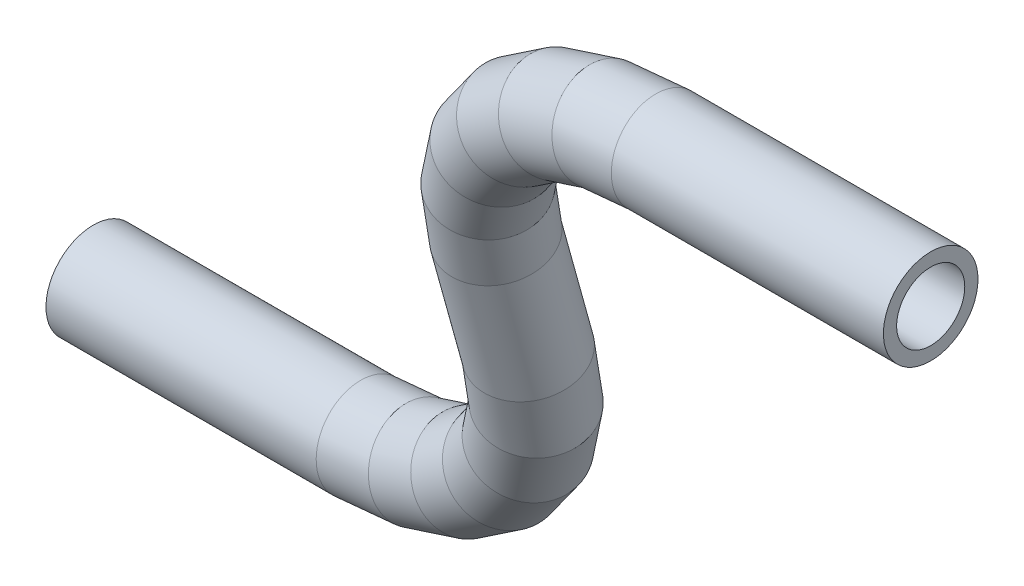
ISO-10303-21;
HEADER;
FILE_DESCRIPTION(('STEP AP214'),'2;1');
FILE_NAME('part.step','',(''),(''),'','','');
FILE_SCHEMA(('AUTOMOTIVE_DESIGN { 1 0 10303 214 1 1 1 1 }'));
ENDSEC;
DATA;
#1=APPLICATION_CONTEXT('core data for automotive mechanical design processes');
#2=APPLICATION_PROTOCOL_DEFINITION('international standard','automotive_design',2000,#1);
#3=PRODUCT_CONTEXT('',#1,'mechanical');
#4=PRODUCT('Part','Part','',(#3));
#5=PRODUCT_RELATED_PRODUCT_CATEGORY('part','',(#4));
#6=PRODUCT_DEFINITION_FORMATION('','',#4);
#7=PRODUCT_DEFINITION_CONTEXT('part definition',#1,'design');
#8=PRODUCT_DEFINITION('design','',#6,#7);
#9=PRODUCT_DEFINITION_SHAPE('','',#8);
#10=(LENGTH_UNIT() NAMED_UNIT(*) SI_UNIT(.MILLI.,.METRE.));
#11=(NAMED_UNIT(*) PLANE_ANGLE_UNIT() SI_UNIT($,.RADIAN.));
#12=(NAMED_UNIT(*) SI_UNIT($,.STERADIAN.) SOLID_ANGLE_UNIT());
#13=UNCERTAINTY_MEASURE_WITH_UNIT(LENGTH_MEASURE(1.E-05),#10,'distance_accuracy_value','');
#14=(GEOMETRIC_REPRESENTATION_CONTEXT(3) GLOBAL_UNCERTAINTY_ASSIGNED_CONTEXT((#13)) GLOBAL_UNIT_ASSIGNED_CONTEXT((#10,
#11,#12)) REPRESENTATION_CONTEXT('',''));
#15=CARTESIAN_POINT('',(0.,0.,0.));
#16=DIRECTION('',(0.,0.,1.));
#17=DIRECTION('',(1.,0.,0.));
#18=AXIS2_PLACEMENT_3D('',#15,#16,#17);
#19=CARTESIAN_POINT('',(-2128.58562550298,-63.4415450925657,-29.5832783218494));
#20=DIRECTION('',(-1.,0.,0.));
#21=DIRECTION('',(0.,0.,1.));
#22=AXIS2_PLACEMENT_3D('',#19,#20,#21);
#23=CYLINDRICAL_SURFACE('',#22,3.175);
#24=CARTESIAN_POINT('',(-2129.18796047896,-63.4415450925662,-29.5832783218491));
#25=DIRECTION('',(-0.997858923238603,-0.0630260562709326,-0.0174724223858227));
#26=DIRECTION('',(0.0654031292301474,-0.961591798233087,-0.266577651459687));
#27=AXIS2_PLACEMENT_3D('',#24,#25,#26);
#28=ELLIPSE('',#27,3.18181250481318,3.175);
#29=CARTESIAN_POINT('',(-2128.97985998452,-66.50114990071,-30.4314784267672));
#30=VERTEX_POINT('',#29);
#31=EDGE_CURVE('E45',#30,#30,#28,.T.);
#32=ORIENTED_EDGE('',*,*,#31,.T.);
#33=EDGE_LOOP('',(#32));
#34=FACE_BOUND('',#33,.T.);
#35=CARTESIAN_POINT('',(-2147.38796047896,-63.4415450925657,-29.5832783218494));
#36=DIRECTION('',(1.,0.,0.));
#37=DIRECTION('',(0.,0.,-1.));
#38=AXIS2_PLACEMENT_3D('',#35,#36,#37);
#39=CIRCLE('',#38,3.175);
#40=CARTESIAN_POINT('',(-2147.38796047896,-63.4415450925657,-32.7582783218494));
#41=VERTEX_POINT('',#40);
#42=EDGE_CURVE('E98',#41,#41,#39,.T.);
#43=ORIENTED_EDGE('',*,*,#42,.T.);
#44=EDGE_LOOP('',(#43));
#45=FACE_BOUND('',#44,.T.);
#46=ADVANCED_FACE('F39',(#34,#45),#23,.T.);
#47=CARTESIAN_POINT('',(-2124.20615790968,-62.8095157810567,-29.408063755933));
#48=DIRECTION('',(-0.991444861373809,-0.125782225292977,-0.0348700251765742));
#49=DIRECTION('',(0.125858765577275,-0.992048169761612,0.));
#50=AXIS2_PLACEMENT_3D('',#47,#48,#49);
#51=CYLINDRICAL_SURFACE('',#50,3.175);
#52=CARTESIAN_POINT('',(-2125.30567480242,-62.9490088450726,-29.4467347735818));
#53=DIRECTION('',(-0.965925826289069,-0.249412281837751,-0.0691434145545732));
#54=DIRECTION('',(0.258819045102518,-0.930819307850187,-0.258046736126463));
#55=AXIS2_PLACEMENT_3D('',#52,#53,#54);
#56=ELLIPSE('',#55,3.20239694984198,3.175);
#57=CARTESIAN_POINT('',(-2124.47683348182,-65.9298617573861,-30.2731028542698));
#58=VERTEX_POINT('',#57);
#59=EDGE_CURVE('E137',#58,#58,#56,.T.);
#60=ORIENTED_EDGE('',*,*,#59,.T.);
#61=EDGE_LOOP('',(#60));
#62=FACE_BOUND('',#61,.T.);
#63=ORIENTED_EDGE('',*,*,#31,.F.);
#64=EDGE_LOOP('',(#63));
#65=FACE_BOUND('',#64,.T.);
#66=ADVANCED_FACE('F144',(#62,#65),#51,.T.);
#67=CARTESIAN_POINT('',(-2120.66337384542,-61.0959926636453,-28.9330316589448));
#68=DIRECTION('',(-0.923879532511293,-0.368774825090133,-0.102233740939367));
#69=DIRECTION('',(0.37071723346585,-0.92874578481489,0.));
#70=AXIS2_PLACEMENT_3D('',#67,#68,#69);
#71=CYLINDRICAL_SURFACE('',#70,3.175);
#72=CARTESIAN_POINT('',(-2121.68796047896,-61.5049656339033,-29.0464093459449));
#73=DIRECTION('',(-0.866025403784438,-0.481827528841549,-0.13357481967215));
#74=DIRECTION('',(0.500000000000001,-0.834549760438917,-0.23135837428402));
#75=AXIS2_PLACEMENT_3D('',#72,#73,#74);
#76=ELLIPSE('',#75,3.20239694984199,3.175);
#77=CARTESIAN_POINT('',(-2120.08676200404,-64.1775252412242,-29.7873106980724));
#78=VERTEX_POINT('',#77);
#79=EDGE_CURVE('E131',#78,#78,#76,.T.);
#80=ORIENTED_EDGE('',*,*,#79,.T.);
#81=EDGE_LOOP('',(#80));
#82=FACE_BOUND('',#81,.T.);
#83=ORIENTED_EDGE('',*,*,#59,.F.);
#84=EDGE_LOOP('',(#83));
#85=FACE_BOUND('',#84,.T.);
#86=ADVANCED_FACE('F150',(#82,#85),#71,.T.);
#87=CARTESIAN_POINT('',(-2117.70152627269,-58.5572425730689,-28.2292257009152));
#88=DIRECTION('',(-0.793353340291224,-0.586636029986656,-0.162630396206404));
#89=DIRECTION('',(0.594551255216975,-0.804057712431091,0.));
#90=AXIS2_PLACEMENT_3D('',#87,#88,#89);
#91=CYLINDRICAL_SURFACE('',#90,3.175);
#92=CARTESIAN_POINT('',(-2118.58135876116,-59.2078246175059,-28.4095835552631));
#93=DIRECTION('',(-0.70710678118655,-0.681407026012429,-0.188903321571893));
#94=DIRECTION('',(0.707106781186545,-0.681407026012436,-0.188903321571886));
#95=AXIS2_PLACEMENT_3D('',#92,#93,#94);
#96=ELLIPSE('',#95,3.20239694984198,3.175);
#97=CARTESIAN_POINT('',(-2116.31692216188,-61.389960399209,-29.0145269760799));
#98=VERTEX_POINT('',#97);
#99=EDGE_CURVE('E132',#98,#98,#96,.T.);
#100=ORIENTED_EDGE('',*,*,#99,.T.);
#101=EDGE_LOOP('',(#100));
#102=FACE_BOUND('',#101,.T.);
#103=ORIENTED_EDGE('',*,*,#79,.F.);
#104=EDGE_LOOP('',(#103));
#105=FACE_BOUND('',#104,.T.);
#106=ADVANCED_FACE('F155',(#102,#105),#91,.T.);
#107=CARTESIAN_POINT('',(-2115.52246020889,-55.3662771325172,-27.3446090947895));
#108=DIRECTION('',(-0.60876142900874,-0.764518958901413,-0.211944058731393));
#109=DIRECTION('',(0.782291207263531,-0.622912888804018,0.));
#110=AXIS2_PLACEMENT_3D('',#107,#108,#109);
#111=CYLINDRICAL_SURFACE('',#110,3.175);
#112=CARTESIAN_POINT('',(-2116.19757942219,-56.2141321599425,-27.5796560267668));
#113=DIRECTION('',(-0.500000000000009,-0.834549760438915,-0.231358374284011));
#114=DIRECTION('',(0.866025403784433,-0.481827528841555,-0.133574819672157));
#115=AXIS2_PLACEMENT_3D('',#112,#113,#114);
#116=ELLIPSE('',#115,3.20239694984199,3.175);
#117=CARTESIAN_POINT('',(-2113.42422231063,-57.7571351686546,-28.0074156218606));
#118=VERTEX_POINT('',#117);
#119=EDGE_CURVE('E126',#118,#118,#116,.T.);
#120=ORIENTED_EDGE('',*,*,#119,.T.);
#121=EDGE_LOOP('',(#120));
#122=FACE_BOUND('',#121,.T.);
#123=ORIENTED_EDGE('',*,*,#99,.F.);
#124=EDGE_LOOP('',(#123));
#125=FACE_BOUND('',#124,.T.);
#126=ADVANCED_FACE('F266',(#122,#125),#111,.T.);
#127=CARTESIAN_POINT('',(-2114.27467540519,-51.7405553634442,-26.339467000377));
#128=DIRECTION('',(-0.382683432365086,-0.890301184194397,-0.24681408390797));
#129=DIRECTION('',(0.91872388240474,-0.394900529119881,0.));
#130=AXIS2_PLACEMENT_3D('',#127,#128,#129);
#131=CYLINDRICAL_SURFACE('',#130,3.175);
#132=CARTESIAN_POINT('',(-2114.69907308462,-52.7279034548856,-26.6131849500028));
#133=DIRECTION('',(-0.258819045102501,-0.930819307850189,-0.258046736126469));
#134=DIRECTION('',(0.965925826289074,-0.249412281837735,-0.069143414554567));
#135=AXIS2_PLACEMENT_3D('',#132,#133,#134);
#136=ELLIPSE('',#135,3.20239694984199,3.175);
#137=CARTESIAN_POINT('',(-2111.60579516474,-53.5266205854959,-26.834609609874));
#138=VERTEX_POINT('',#137);
#139=EDGE_CURVE('E123',#138,#138,#136,.T.);
#140=ORIENTED_EDGE('',*,*,#139,.T.);
#141=EDGE_LOOP('',(#140));
#142=FACE_BOUND('',#141,.T.);
#143=ORIENTED_EDGE('',*,*,#119,.F.);
#144=EDGE_LOOP('',(#143));
#145=FACE_BOUND('',#144,.T.);
#146=ADVANCED_FACE('F265',(#142,#145),#131,.T.);
#147=CARTESIAN_POINT('',(-2114.1093399881,-48.411241852877,-25.416496797999));
#148=DIRECTION('',(-0.130526192220016,-0.955410855076793,-0.264864137145772));
#149=DIRECTION('',(0.,0.267149639344298,-0.963655057683096));
#150=AXIS2_PLACEMENT_3D('',#147,#148,#149);
#151=CYLINDRICAL_SURFACE('',#150,3.175);
#152=CARTESIAN_POINT('',(-2114.18796047896,-48.9867192273191,-25.5760337316843));
#153=DIRECTION('',(-0.065403129230125,-0.96159179823309,-0.266577651459683));
#154=DIRECTION('',(0.997858923238605,-0.0630260562709107,-0.0174724223858181));
#155=AXIS2_PLACEMENT_3D('',#152,#153,#154);
#156=ELLIPSE('',#155,3.18181250481317,3.175);
#157=CARTESIAN_POINT('',(-2111.01296047896,-49.187256321291,-25.6316277037209));
#158=VERTEX_POINT('',#157);
#159=EDGE_CURVE('E124',#158,#158,#156,.T.);
#160=ORIENTED_EDGE('',*,*,#159,.T.);
#161=EDGE_LOOP('',(#160));
#162=FACE_BOUND('',#161,.T.);
#163=ORIENTED_EDGE('',*,*,#139,.F.);
#164=EDGE_LOOP('',(#163));
#165=FACE_BOUND('',#164,.T.);
#166=ADVANCED_FACE('F256',(#162,#165),#151,.T.);
#167=CARTESIAN_POINT('',(-2114.18796047896,-40.5719435335981,-23.2432443442186));
#168=DIRECTION('',(0.,-0.963655057683096,-0.267149639344298));
#169=DIRECTION('',(0.,0.267149639344298,-0.963655057683096));
#170=AXIS2_PLACEMENT_3D('',#167,#168,#169);
#171=CYLINDRICAL_SURFACE('',#170,3.175);
#172=CARTESIAN_POINT('',(-2114.18796047896,-41.1523866796198,-23.404157915816));
#173=DIRECTION('',(-0.0654031292301811,-0.961591798233086,-0.266577651459682));
#174=DIRECTION('',(-0.997858923238601,0.0630260562709627,0.0174724223858404));
#175=AXIS2_PLACEMENT_3D('',#172,#173,#174);
#176=ELLIPSE('',#175,3.18181250481319,3.175);
#177=CARTESIAN_POINT('',(-2117.36296047896,-40.9518495856478,-23.3485639437793));
#178=VERTEX_POINT('',#177);
#179=EDGE_CURVE('E116',#178,#178,#176,.T.);
#180=ORIENTED_EDGE('',*,*,#179,.T.);
#181=EDGE_LOOP('',(#180));
#182=FACE_BOUND('',#181,.T.);
#183=ORIENTED_EDGE('',*,*,#159,.F.);
#184=EDGE_LOOP('',(#183));
#185=FACE_BOUND('',#184,.T.);
#186=ADVANCED_FACE('F255',(#182,#185),#171,.T.);
#187=CARTESIAN_POINT('',(-2113.53209372822,-36.3516474373593,-22.0732711561497));
#188=DIRECTION('',(-0.130526192220127,-0.955410855076779,-0.264864137145768));
#189=DIRECTION('',(0.,0.267149639344297,-0.963655057683096));
#190=AXIS2_PLACEMENT_3D('',#187,#188,#189);
#191=CYLINDRICAL_SURFACE('',#190,3.175);
#192=CARTESIAN_POINT('',(-2113.67684787329,-37.4112024520535,-22.3670066974976));
#193=DIRECTION('',(-0.258819045102505,-0.930819307850189,-0.258046736126469));
#194=DIRECTION('',(-0.965925826289073,0.24941228183774,0.0691434145545635));
#195=AXIS2_PLACEMENT_3D('',#192,#193,#194);
#196=ELLIPSE('',#195,3.20239694984195,3.175);
#197=CARTESIAN_POINT('',(-2116.77012579318,-36.6124853214432,-22.1455820376264));
#198=VERTEX_POINT('',#197);
#199=EDGE_CURVE('E117',#198,#198,#196,.T.);
#200=ORIENTED_EDGE('',*,*,#199,.T.);
#201=EDGE_LOOP('',(#200));
#202=FACE_BOUND('',#201,.T.);
#203=ORIENTED_EDGE('',*,*,#179,.F.);
#204=EDGE_LOOP('',(#203));
#205=FACE_BOUND('',#204,.T.);
#206=ADVANCED_FACE('F248',(#202,#205),#191,.T.);
#207=CARTESIAN_POINT('',(-2111.75394385629,-32.9376256555554,-21.1268176711079));
#208=DIRECTION('',(-0.382683432364989,-0.890301184194436,-0.246814083907981));
#209=DIRECTION('',(0.918723882404783,-0.394900529119781,0.));
#210=AXIS2_PLACEMENT_3D('',#207,#208,#209);
#211=CYLINDRICAL_SURFACE('',#210,3.175);
#212=CARTESIAN_POINT('',(-2112.17834153572,-33.9249737469965,-21.4005356207339));
#213=DIRECTION('',(-0.499999999999964,-0.83454976043894,-0.231358374284019));
#214=DIRECTION('',(-0.866025403784459,0.481827528841512,0.133574819672144));
#215=AXIS2_PLACEMENT_3D('',#212,#213,#214);
#216=ELLIPSE('',#215,3.20239694984201,3.175);
#217=CARTESIAN_POINT('',(-2114.95169864729,-32.3819707382845,-20.9727760256402));
#218=VERTEX_POINT('',#217);
#219=EDGE_CURVE('E114',#218,#218,#216,.T.);
#220=ORIENTED_EDGE('',*,*,#219,.T.);
#221=EDGE_LOOP('',(#220));
#222=FACE_BOUND('',#221,.T.);
#223=ORIENTED_EDGE('',*,*,#199,.F.);
#224=EDGE_LOOP('',(#223));
#225=FACE_BOUND('',#224,.T.);
#226=ADVANCED_FACE('F247',(#222,#225),#211,.T.);
#227=CARTESIAN_POINT('',(-2109.11944298345,-30.083426262008,-20.3355611602604));
#228=DIRECTION('',(-0.608761429008742,-0.764518958901412,-0.211944058731393));
#229=DIRECTION('',(0.78229120726353,-0.62291288880402,0.));
#230=AXIS2_PLACEMENT_3D('',#227,#228,#229);
#231=CYLINDRICAL_SURFACE('',#230,3.175);
#232=CARTESIAN_POINT('',(-2109.79456219676,-30.9312812894331,-20.5706080922377));
#233=DIRECTION('',(-0.707106781186574,-0.681407026012405,-0.188903321571886));
#234=DIRECTION('',(-0.707106781186521,0.681407026012457,0.1889033215719));
#235=AXIS2_PLACEMENT_3D('',#232,#233,#234);
#236=ELLIPSE('',#235,3.20239694984199,3.175);
#237=CARTESIAN_POINT('',(-2112.05899879604,-28.7491455077299,-19.9656646714209));
#238=VERTEX_POINT('',#237);
#239=EDGE_CURVE('E109',#238,#238,#236,.T.);
#240=ORIENTED_EDGE('',*,*,#239,.T.);
#241=EDGE_LOOP('',(#240));
#242=FACE_BOUND('',#241,.T.);
#243=ORIENTED_EDGE('',*,*,#219,.F.);
#244=EDGE_LOOP('',(#243));
#245=FACE_BOUND('',#244,.T.);
#246=ADVANCED_FACE('F245',(#242,#245),#231,.T.);
#247=CARTESIAN_POINT('',(-2105.80812799049,-27.9835582285992,-19.7534244472082));
#248=DIRECTION('',(-0.793353340291266,-0.586636029986604,-0.162630396206389));
#249=DIRECTION('',(0.594551255216922,-0.804057712431131,0.));
#250=AXIS2_PLACEMENT_3D('',#247,#248,#249);
#251=CYLINDRICAL_SURFACE('',#250,3.175);
#252=CARTESIAN_POINT('',(-2106.68796047896,-28.6341402730357,-19.9337823015559));
#253=DIRECTION('',(-0.866025403784444,-0.481827528841538,-0.133574819672147));
#254=DIRECTION('',(-0.49999999999999,0.834549760438926,0.231358374284013));
#255=AXIS2_PLACEMENT_3D('',#252,#253,#254);
#256=ELLIPSE('',#255,3.20239694984197,3.175);
#257=CARTESIAN_POINT('',(-2108.28915895388,-25.9615806657148,-19.1928809494284));
#258=VERTEX_POINT('',#257);
#259=EDGE_CURVE('E110',#258,#258,#256,.T.);
#260=ORIENTED_EDGE('',*,*,#259,.T.);
#261=EDGE_LOOP('',(#260));
#262=FACE_BOUND('',#261,.T.);
#263=ORIENTED_EDGE('',*,*,#239,.F.);
#264=EDGE_LOOP('',(#263));
#265=FACE_BOUND('',#264,.T.);
#266=ADVANCED_FACE('F236',(#262,#265),#251,.T.);
#267=CARTESIAN_POINT('',(-2102.04565952196,-26.7811240916086,-19.420079186919));
#268=DIRECTION('',(-0.923879532511276,-0.36877482509017,-0.102233740939379));
#269=DIRECTION('',(0.370717233465888,-0.928745784814875,0.));
#270=AXIS2_PLACEMENT_3D('',#267,#268,#269);
#271=CYLINDRICAL_SURFACE('',#270,3.175);
#272=CARTESIAN_POINT('',(-2103.0702461555,-27.1900970618669,-19.5334568739191));
#273=DIRECTION('',(-0.965925826289065,-0.249412281837765,-0.0691434145545769));
#274=DIRECTION('',(-0.258819045102532,0.93081930785018,0.258046736126473));
#275=AXIS2_PLACEMENT_3D('',#272,#273,#274);
#276=ELLIPSE('',#275,3.20239694984199,3.175);
#277=CARTESIAN_POINT('',(-2103.89908747609,-24.2092441495535,-18.707088793231));
#278=VERTEX_POINT('',#277);
#279=EDGE_CURVE('E102',#278,#278,#276,.T.);
#280=ORIENTED_EDGE('',*,*,#279,.T.);
#281=EDGE_LOOP('',(#280));
#282=FACE_BOUND('',#281,.T.);
#283=ORIENTED_EDGE('',*,*,#259,.F.);
#284=EDGE_LOOP('',(#283));
#285=FACE_BOUND('',#284,.T.);
#286=ADVANCED_FACE('F231',(#282,#285),#271,.T.);
#287=CARTESIAN_POINT('',(-2098.5907785622,-26.6217977807229,-19.3759098898745));
#288=DIRECTION('',(-0.991444861373811,-0.125782225292965,-0.0348700251765693));
#289=DIRECTION('',(0.125858765577264,-0.992048169761614,0.));
#290=AXIS2_PLACEMENT_3D('',#287,#288,#289);
#291=CYLINDRICAL_SURFACE('',#290,3.175);
#292=CARTESIAN_POINT('',(-2099.18796047896,-26.6975608143733,-19.3969133256516));
#293=DIRECTION('',(-0.997858923238604,-0.0630260562709268,-0.0174724223858203));
#294=DIRECTION('',(-0.0654031292301412,0.961591798233091,0.266577651459675));
#295=AXIS2_PLACEMENT_3D('',#292,#293,#294);
#296=ELLIPSE('',#295,3.18181250481318,3.175);
#297=CARTESIAN_POINT('',(-2099.3960609734,-23.6379560062294,-18.5487132207335));
#298=VERTEX_POINT('',#297);
#299=EDGE_CURVE('E101',#298,#298,#296,.T.);
#300=ORIENTED_EDGE('',*,*,#299,.T.);
#301=EDGE_LOOP('',(#300));
#302=FACE_BOUND('',#301,.T.);
#303=ORIENTED_EDGE('',*,*,#279,.F.);
#304=EDGE_LOOP('',(#303));
#305=FACE_BOUND('',#304,.T.);
#306=ADVANCED_FACE('F228',(#302,#305),#291,.T.);
#307=CARTESIAN_POINT('',(-2080.98796047896,-26.6975608143733,-19.3969133256516));
#308=DIRECTION('',(-1.,0.,0.));
#309=DIRECTION('',(0.,0.,1.));
#310=AXIS2_PLACEMENT_3D('',#307,#308,#309);
#311=CYLINDRICAL_SURFACE('',#310,3.175);
#312=CARTESIAN_POINT('',(-2080.98796047896,-26.6975608143733,-19.3969133256516));
#313=DIRECTION('',(1.,0.,0.));
#314=DIRECTION('',(0.,0.,-1.));
#315=AXIS2_PLACEMENT_3D('',#312,#313,#314);
#316=CIRCLE('',#315,3.175);
#317=CARTESIAN_POINT('',(-2080.98796047896,-26.6975608143733,-22.5719133256516));
#318=VERTEX_POINT('',#317);
#319=EDGE_CURVE('E92',#318,#318,#316,.T.);
#320=ORIENTED_EDGE('',*,*,#319,.F.);
#321=EDGE_LOOP('',(#320));
#322=FACE_BOUND('',#321,.T.);
#323=ORIENTED_EDGE('',*,*,#299,.F.);
#324=EDGE_LOOP('',(#323));
#325=FACE_BOUND('',#324,.T.);
#326=ADVANCED_FACE('F227',(#322,#325),#311,.T.);
#327=CARTESIAN_POINT('',(-2147.38796047896,-63.4415450925657,-29.5832783218494));
#328=DIRECTION('',(1.,0.,0.));
#329=DIRECTION('',(0.,0.,-1.));
#330=AXIS2_PLACEMENT_3D('',#327,#328,#329);
#331=PLANE('',#330);
#332=CARTESIAN_POINT('',(-2147.38796047896,-63.4415450925657,-29.5832783218494));
#333=DIRECTION('',(1.,0.,0.));
#334=DIRECTION('',(0.,0.,-1.));
#335=AXIS2_PLACEMENT_3D('',#332,#333,#334);
#336=CIRCLE('',#335,2.286);
#337=CARTESIAN_POINT('',(-2147.38796047896,-63.4415450925657,-31.8692783218494));
#338=VERTEX_POINT('',#337);
#339=EDGE_CURVE('E95',#338,#338,#336,.F.);
#340=ORIENTED_EDGE('',*,*,#339,.F.);
#341=EDGE_LOOP('',(#340));
#342=FACE_BOUND('',#341,.T.);
#343=ORIENTED_EDGE('',*,*,#42,.F.);
#344=EDGE_LOOP('',(#343));
#345=FACE_BOUND('',#344,.T.);
#346=ADVANCED_FACE('F225',(#342,#345),#331,.F.);
#347=CARTESIAN_POINT('',(-2080.98796047896,-26.6975608143733,-19.3969133256516));
#348=DIRECTION('',(1.,0.,0.));
#349=DIRECTION('',(0.,0.,-1.));
#350=AXIS2_PLACEMENT_3D('',#347,#348,#349);
#351=PLANE('',#350);
#352=CARTESIAN_POINT('',(-2080.98796047896,-26.6975608143733,-19.3969133256516));
#353=DIRECTION('',(1.,0.,0.));
#354=DIRECTION('',(0.,0.,-1.));
#355=AXIS2_PLACEMENT_3D('',#352,#353,#354);
#356=CIRCLE('',#355,2.286);
#357=CARTESIAN_POINT('',(-2080.98796047896,-26.6975608143733,-21.6829133256516));
#358=VERTEX_POINT('',#357);
#359=EDGE_CURVE('E46',#358,#358,#356,.F.);
#360=ORIENTED_EDGE('',*,*,#359,.T.);
#361=EDGE_LOOP('',(#360));
#362=FACE_BOUND('',#361,.T.);
#363=ORIENTED_EDGE('',*,*,#319,.T.);
#364=EDGE_LOOP('',(#363));
#365=FACE_BOUND('',#364,.T.);
#366=ADVANCED_FACE('F217',(#362,#365),#351,.T.);
#367=CARTESIAN_POINT('',(-2128.72627929625,-63.4415450925657,-29.5832783218494));
#368=DIRECTION('',(-1.,0.,0.));
#369=DIRECTION('',(0.,0.,1.));
#370=AXIS2_PLACEMENT_3D('',#367,#368,#369);
#371=CYLINDRICAL_SURFACE('',#370,2.286);
#372=CARTESIAN_POINT('',(-2129.18796047896,-63.4415450925662,-29.5832783218491));
#373=DIRECTION('',(-0.997858923238603,-0.0630260562709326,-0.0174724223858227));
#374=DIRECTION('',(0.0654031292301474,-0.961591798233087,-0.266577651459687));
#375=AXIS2_PLACEMENT_3D('',#372,#373,#374);
#376=ELLIPSE('',#375,2.29090500346549,2.286);
#377=CARTESIAN_POINT('',(-2129.03812812296,-65.6444605544298,-30.1939823973902));
#378=VERTEX_POINT('',#377);
#379=EDGE_CURVE('E90',#378,#378,#376,.F.);
#380=ORIENTED_EDGE('',*,*,#379,.T.);
#381=EDGE_LOOP('',(#380));
#382=FACE_BOUND('',#381,.T.);
#383=ORIENTED_EDGE('',*,*,#339,.T.);
#384=EDGE_LOOP('',(#383));
#385=FACE_BOUND('',#384,.T.);
#386=ADVANCED_FACE('F212',(#382,#385),#371,.F.);
#387=CARTESIAN_POINT('',(-2124.48626218353,-62.8450519366729,-29.4179152801696));
#388=DIRECTION('',(-0.991444861373809,-0.125782225292977,-0.0348700251765742));
#389=DIRECTION('',(0.125858765577275,-0.992048169761612,0.));
#390=AXIS2_PLACEMENT_3D('',#387,#388,#389);
#391=CYLINDRICAL_SURFACE('',#390,2.286);
#392=CARTESIAN_POINT('',(-2125.30567480242,-62.9490088450726,-29.4467347735817));
#393=DIRECTION('',(-0.965925826289069,-0.249412281837751,-0.0691434145545732));
#394=DIRECTION('',(0.258819045102518,-0.930819307850186,-0.258046736126464));
#395=AXIS2_PLACEMENT_3D('',#392,#393,#394);
#396=ELLIPSE('',#395,2.30572580388623,2.286);
#397=CARTESIAN_POINT('',(-2124.70890905159,-65.0952229419383,-30.0417197916772));
#398=VERTEX_POINT('',#397);
#399=EDGE_CURVE('E88',#398,#398,#396,.F.);
#400=ORIENTED_EDGE('',*,*,#399,.T.);
#401=EDGE_LOOP('',(#400));
#402=FACE_BOUND('',#401,.T.);
#403=ORIENTED_EDGE('',*,*,#379,.F.);
#404=EDGE_LOOP('',(#403));
#405=FACE_BOUND('',#404,.T.);
#406=ADVANCED_FACE('F209',(#402,#405),#391,.F.);
#407=CARTESIAN_POINT('',(-2120.9243894759,-61.2001794002152,-28.9619148665586));
#408=DIRECTION('',(-0.923879532511293,-0.368774825090133,-0.102233740939367));
#409=DIRECTION('',(0.37071723346585,-0.92874578481489,0.));
#410=AXIS2_PLACEMENT_3D('',#407,#408,#409);
#411=CYLINDRICAL_SURFACE('',#410,2.286);
#412=CARTESIAN_POINT('',(-2121.68796047896,-61.5049656339032,-29.0464093459448));
#413=DIRECTION('',(-0.866025403784438,-0.481827528841549,-0.13357481967215));
#414=DIRECTION('',(0.500000000000001,-0.834549760438917,-0.23135837428402));
#415=AXIS2_PLACEMENT_3D('',#412,#413,#414);
#416=ELLIPSE('',#415,2.30572580388623,2.286);
#417=CARTESIAN_POINT('',(-2120.53509757701,-63.4292085511743,-29.5798583194767));
#418=VERTEX_POINT('',#417);
#419=EDGE_CURVE('E85',#418,#418,#416,.F.);
#420=ORIENTED_EDGE('',*,*,#419,.T.);
#421=EDGE_LOOP('',(#420));
#422=FACE_BOUND('',#421,.T.);
#423=ORIENTED_EDGE('',*,*,#399,.F.);
#424=EDGE_LOOP('',(#423));
#425=FACE_BOUND('',#424,.T.);
#426=ADVANCED_FACE('F206',(#422,#425),#411,.F.);
#427=CARTESIAN_POINT('',(-2117.92566547594,-58.7229797366715,-28.2751722490388));
#428=DIRECTION('',(-0.793353340291224,-0.586636029986656,-0.162630396206404));
#429=DIRECTION('',(0.594551255216975,-0.804057712431091,0.));
#430=AXIS2_PLACEMENT_3D('',#427,#428,#429);
#431=CYLINDRICAL_SURFACE('',#430,2.286);
#432=CARTESIAN_POINT('',(-2118.58135876116,-59.2078246175058,-28.4095835552631));
#433=DIRECTION('',(-0.70710678118655,-0.681407026012429,-0.188903321571893));
#434=DIRECTION('',(0.707106781186545,-0.681407026012436,-0.188903321571886));
#435=AXIS2_PLACEMENT_3D('',#432,#433,#434);
#436=ELLIPSE('',#435,2.30572580388622,2.286);
#437=CARTESIAN_POINT('',(-2116.95096440967,-60.7789623803321,-28.8451428182512));
#438=VERTEX_POINT('',#437);
#439=EDGE_CURVE('E78',#438,#438,#436,.F.);
#440=ORIENTED_EDGE('',*,*,#439,.T.);
#441=EDGE_LOOP('',(#440));
#442=FACE_BOUND('',#441,.T.);
#443=ORIENTED_EDGE('',*,*,#419,.F.);
#444=EDGE_LOOP('',(#443));
#445=FACE_BOUND('',#444,.T.);
#446=ADVANCED_FACE('F205',(#442,#445),#431,.F.);
#447=CARTESIAN_POINT('',(-2115.6944482686,-55.5822700093469,-27.4044878020986));
#448=DIRECTION('',(-0.60876142900874,-0.764518958901413,-0.211944058731393));
#449=DIRECTION('',(0.782291207263531,-0.622912888804018,0.));
#450=AXIS2_PLACEMENT_3D('',#447,#448,#449);
#451=CYLINDRICAL_SURFACE('',#450,2.286);
#452=CARTESIAN_POINT('',(-2116.19757942219,-56.2141321599425,-27.5796560267668));
#453=DIRECTION('',(-0.500000000000009,-0.834549760438915,-0.231358374284011));
#454=DIRECTION('',(0.866025403784433,-0.481827528841555,-0.133574819672156));
#455=AXIS2_PLACEMENT_3D('',#452,#453,#454);
#456=ELLIPSE('',#455,2.30572580388623,2.286);
#457=CARTESIAN_POINT('',(-2114.20076230186,-57.3250943262152,-27.8876429352343));
#458=VERTEX_POINT('',#457);
#459=EDGE_CURVE('E80',#458,#458,#456,.F.);
#460=ORIENTED_EDGE('',*,*,#459,.T.);
#461=EDGE_LOOP('',(#460));
#462=FACE_BOUND('',#461,.T.);
#463=ORIENTED_EDGE('',*,*,#439,.F.);
#464=EDGE_LOOP('',(#463));
#465=FACE_BOUND('',#464,.T.);
#466=ADVANCED_FACE('F196',(#462,#465),#451,.F.);
#467=CARTESIAN_POINT('',(-2114.38279161932,-51.9920843958903,-26.4091972319229));
#468=DIRECTION('',(-0.382683432365086,-0.890301184194397,-0.24681408390797));
#469=DIRECTION('',(0.91872388240474,-0.394900529119881,0.));
#470=AXIS2_PLACEMENT_3D('',#467,#468,#469);
#471=CYLINDRICAL_SURFACE('',#470,2.286);
#472=CARTESIAN_POINT('',(-2114.69907308462,-52.7279034548856,-26.6131849500029));
#473=DIRECTION('',(-0.258819045102501,-0.930819307850189,-0.258046736126469));
#474=DIRECTION('',(0.965925826289074,-0.249412281837735,-0.0691434145545673));
#475=AXIS2_PLACEMENT_3D('',#472,#473,#474);
#476=ELLIPSE('',#475,2.30572580388623,2.286);
#477=CARTESIAN_POINT('',(-2112.47191298231,-53.3029797889251,-26.7726107051101));
#478=VERTEX_POINT('',#477);
#479=EDGE_CURVE('E74',#478,#478,#476,.F.);
#480=ORIENTED_EDGE('',*,*,#479,.T.);
#481=EDGE_LOOP('',(#480));
#482=FACE_BOUND('',#481,.T.);
#483=ORIENTED_EDGE('',*,*,#459,.F.);
#484=EDGE_LOOP('',(#483));
#485=FACE_BOUND('',#484,.T.);
#486=ADVANCED_FACE('F191',(#482,#485),#471,.F.);
#487=CARTESIAN_POINT('',(-2114.12769899216,-48.5456240137785,-25.4537509435907));
#488=DIRECTION('',(-0.130526192220016,-0.955410855076793,-0.264864137145772));
#489=DIRECTION('',(0.,0.267149639344298,-0.963655057683096));
#490=AXIS2_PLACEMENT_3D('',#487,#488,#489);
#491=CYLINDRICAL_SURFACE('',#490,2.286);
#492=CARTESIAN_POINT('',(-2114.18796047896,-48.9867192273191,-25.5760337316844));
#493=DIRECTION('',(-0.065403129230125,-0.96159179823309,-0.266577651459683));
#494=DIRECTION('',(0.997858923238605,-0.0630260562709105,-0.0174724223858189));
#495=AXIS2_PLACEMENT_3D('',#492,#493,#494);
#496=ELLIPSE('',#495,2.29090500346548,2.286);
#497=CARTESIAN_POINT('',(-2111.90196047896,-49.1311059349788,-25.6160613915507));
#498=VERTEX_POINT('',#497);
#499=EDGE_CURVE('E72',#498,#498,#496,.F.);
#500=ORIENTED_EDGE('',*,*,#499,.T.);
#501=EDGE_LOOP('',(#500));
#502=FACE_BOUND('',#501,.T.);
#503=ORIENTED_EDGE('',*,*,#479,.F.);
#504=EDGE_LOOP('',(#503));
#505=FACE_BOUND('',#504,.T.);
#506=ADVANCED_FACE('F188',(#502,#505),#491,.F.);
#507=CARTESIAN_POINT('',(-2114.18796047896,-40.7074852728693,-23.2808199543644));
#508=DIRECTION('',(0.,-0.963655057683096,-0.267149639344298));
#509=DIRECTION('',(0.,0.267149639344298,-0.963655057683096));
#510=AXIS2_PLACEMENT_3D('',#507,#508,#509);
#511=CYLINDRICAL_SURFACE('',#510,2.286);
#512=CARTESIAN_POINT('',(-2114.18796047896,-41.1523866796198,-23.404157915816));
#513=DIRECTION('',(-0.0654031292301811,-0.961591798233086,-0.266577651459682));
#514=DIRECTION('',(-0.997858923238601,0.0630260562709627,0.0174724223858404));
#515=AXIS2_PLACEMENT_3D('',#512,#513,#514);
#516=ELLIPSE('',#515,2.29090500346549,2.286);
#517=CARTESIAN_POINT('',(-2116.47396047896,-41.0079999719599,-23.3641302559497));
#518=VERTEX_POINT('',#517);
#519=EDGE_CURVE('E70',#518,#518,#516,.F.);
#520=ORIENTED_EDGE('',*,*,#519,.T.);
#521=EDGE_LOOP('',(#520));
#522=FACE_BOUND('',#521,.T.);
#523=ORIENTED_EDGE('',*,*,#499,.F.);
#524=EDGE_LOOP('',(#523));
#525=FACE_BOUND('',#524,.T.);
#526=ADVANCED_FACE('F187',(#522,#525),#511,.F.);
#527=CARTESIAN_POINT('',(-2113.56897015546,-36.6215713375315,-22.148100911887));
#528=DIRECTION('',(-0.130526192220127,-0.955410855076779,-0.264864137145768));
#529=DIRECTION('',(0.,0.267149639344297,-0.963655057683096));
#530=AXIS2_PLACEMENT_3D('',#527,#528,#529);
#531=CYLINDRICAL_SURFACE('',#530,2.286);
#532=CARTESIAN_POINT('',(-2113.67684787329,-37.4112024520536,-22.3670066974977));
#533=DIRECTION('',(-0.258819045102505,-0.930819307850189,-0.258046736126469));
#534=DIRECTION('',(-0.965925826289073,0.24941228183774,0.069143414554563));
#535=AXIS2_PLACEMENT_3D('',#532,#533,#534);
#536=ELLIPSE('',#535,2.3057258038862,2.286);
#537=CARTESIAN_POINT('',(-2115.90400797561,-36.8361261180141,-22.2075809423904));
#538=VERTEX_POINT('',#537);
#539=EDGE_CURVE('E63',#538,#538,#536,.F.);
#540=ORIENTED_EDGE('',*,*,#539,.T.);
#541=EDGE_LOOP('',(#540));
#542=FACE_BOUND('',#541,.T.);
#543=ORIENTED_EDGE('',*,*,#519,.F.);
#544=EDGE_LOOP('',(#543));
#545=FACE_BOUND('',#544,.T.);
#546=ADVANCED_FACE('F185',(#542,#545),#531,.F.);
#547=CARTESIAN_POINT('',(-2111.86206007042,-33.1891546880012,-21.1965479026538));
#548=DIRECTION('',(-0.382683432364989,-0.890301184194436,-0.246814083907981));
#549=DIRECTION('',(0.918723882404783,-0.394900529119781,0.));
#550=AXIS2_PLACEMENT_3D('',#547,#548,#549);
#551=CYLINDRICAL_SURFACE('',#550,2.286);
#552=CARTESIAN_POINT('',(-2112.17834153572,-33.9249737469967,-21.4005356207339));
#553=DIRECTION('',(-0.499999999999964,-0.83454976043894,-0.231358374284019));
#554=DIRECTION('',(-0.866025403784459,0.481827528841512,0.133574819672144));
#555=AXIS2_PLACEMENT_3D('',#552,#553,#554);
#556=ELLIPSE('',#555,2.30572580388625,2.286);
#557=CARTESIAN_POINT('',(-2114.17515865605,-32.8140115807241,-21.0925487122664));
#558=VERTEX_POINT('',#557);
#559=EDGE_CURVE('E65',#558,#558,#556,.F.);
#560=ORIENTED_EDGE('',*,*,#559,.T.);
#561=EDGE_LOOP('',(#560));
#562=FACE_BOUND('',#561,.T.);
#563=ORIENTED_EDGE('',*,*,#539,.F.);
#564=EDGE_LOOP('',(#563));
#565=FACE_BOUND('',#564,.T.);
#566=ADVANCED_FACE('F180',(#562,#565),#551,.F.);
#567=CARTESIAN_POINT('',(-2109.29143104317,-30.2994191388379,-20.3954398675695));
#568=DIRECTION('',(-0.608761429008742,-0.764518958901412,-0.211944058731393));
#569=DIRECTION('',(0.78229120726353,-0.62291288880402,0.));
#570=AXIS2_PLACEMENT_3D('',#567,#568,#569);
#571=CYLINDRICAL_SURFACE('',#570,2.286);
#572=CARTESIAN_POINT('',(-2109.79456219676,-30.9312812894333,-20.5706080922378));
#573=DIRECTION('',(-0.707106781186574,-0.681407026012405,-0.188903321571886));
#574=DIRECTION('',(-0.707106781186521,0.681407026012457,0.1889033215719));
#575=AXIS2_PLACEMENT_3D('',#572,#573,#574);
#576=ELLIPSE('',#575,2.30572580388623,2.286);
#577=CARTESIAN_POINT('',(-2111.42495654824,-29.360143526607,-20.1350488292497));
#578=VERTEX_POINT('',#577);
#579=EDGE_CURVE('E56',#578,#578,#576,.F.);
#580=ORIENTED_EDGE('',*,*,#579,.T.);
#581=EDGE_LOOP('',(#580));
#582=FACE_BOUND('',#581,.T.);
#583=ORIENTED_EDGE('',*,*,#559,.F.);
#584=EDGE_LOOP('',(#583));
#585=FACE_BOUND('',#584,.T.);
#586=ADVANCED_FACE('F171',(#582,#585),#571,.F.);
#587=CARTESIAN_POINT('',(-2106.03226719373,-28.1492953922018,-19.7993709953318));
#588=DIRECTION('',(-0.793353340291266,-0.586636029986604,-0.162630396206389));
#589=DIRECTION('',(0.594551255216922,-0.804057712431131,0.));
#590=AXIS2_PLACEMENT_3D('',#587,#588,#589);
#591=CYLINDRICAL_SURFACE('',#590,2.286);
#592=CARTESIAN_POINT('',(-2106.68796047896,-28.6341402730358,-19.9337823015559));
#593=DIRECTION('',(-0.866025403784444,-0.481827528841538,-0.133574819672147));
#594=DIRECTION('',(-0.49999999999999,0.834549760438926,0.231358374284013));
#595=AXIS2_PLACEMENT_3D('',#592,#593,#594);
#596=ELLIPSE('',#595,2.30572580388622,2.286);
#597=CARTESIAN_POINT('',(-2107.8408233809,-26.7098973557647,-19.4003333280241));
#598=VERTEX_POINT('',#597);
#599=EDGE_CURVE('E57',#598,#598,#596,.F.);
#600=ORIENTED_EDGE('',*,*,#599,.T.);
#601=EDGE_LOOP('',(#600));
#602=FACE_BOUND('',#601,.T.);
#603=ORIENTED_EDGE('',*,*,#579,.F.);
#604=EDGE_LOOP('',(#603));
#605=FACE_BOUND('',#604,.T.);
#606=ADVANCED_FACE('F168',(#602,#605),#591,.F.);
#607=CARTESIAN_POINT('',(-2102.30667515244,-26.8853108281786,-19.4489623945328));
#608=DIRECTION('',(-0.923879532511277,-0.36877482509017,-0.102233740939379));
#609=DIRECTION('',(0.370717233465888,-0.928745784814875,0.));
#610=AXIS2_PLACEMENT_3D('',#607,#608,#609);
#611=CYLINDRICAL_SURFACE('',#610,2.286);
#612=CARTESIAN_POINT('',(-2103.0702461555,-27.190097061867,-19.5334568739191));
#613=DIRECTION('',(-0.965925826289065,-0.249412281837764,-0.0691434145545769));
#614=DIRECTION('',(-0.258819045102532,0.93081930785018,0.258046736126473));
#615=AXIS2_PLACEMENT_3D('',#612,#613,#614);
#616=ELLIPSE('',#615,2.30572580388623,2.286);
#617=CARTESIAN_POINT('',(-2103.66701190633,-25.0438829650013,-18.9384718558237));
#618=VERTEX_POINT('',#617);
#619=EDGE_CURVE('E51',#618,#618,#616,.F.);
#620=ORIENTED_EDGE('',*,*,#619,.T.);
#621=EDGE_LOOP('',(#620));
#622=FACE_BOUND('',#621,.T.);
#623=ORIENTED_EDGE('',*,*,#599,.F.);
#624=EDGE_LOOP('',(#623));
#625=FACE_BOUND('',#624,.T.);
#626=ADVANCED_FACE('F162',(#622,#625),#611,.F.);
#627=CARTESIAN_POINT('',(-2098.73022904277,-26.6394895278368,-19.3808144911872));
#628=DIRECTION('',(-0.991444861373811,-0.125782225292965,-0.0348700251765693));
#629=DIRECTION('',(0.125858765577264,-0.992048169761614,0.));
#630=AXIS2_PLACEMENT_3D('',#627,#628,#629);
#631=CYLINDRICAL_SURFACE('',#630,2.286);
#632=CARTESIAN_POINT('',(-2099.18796047896,-26.6975608143733,-19.3969133256516));
#633=DIRECTION('',(-0.997858923238604,-0.0630260562709268,-0.0174724223858203));
#634=DIRECTION('',(-0.0654031292301412,0.961591798233091,0.266577651459675));
#635=AXIS2_PLACEMENT_3D('',#632,#633,#634);
#636=ELLIPSE('',#635,2.29090500346549,2.286);
#637=CARTESIAN_POINT('',(-2099.33779283495,-24.4946453525097,-18.7862092501106));
#638=VERTEX_POINT('',#637);
#639=EDGE_CURVE('E10',#638,#638,#636,.F.);
#640=ORIENTED_EDGE('',*,*,#639,.T.);
#641=EDGE_LOOP('',(#640));
#642=FACE_BOUND('',#641,.T.);
#643=ORIENTED_EDGE('',*,*,#619,.F.);
#644=EDGE_LOOP('',(#643));
#645=FACE_BOUND('',#644,.T.);
#646=ADVANCED_FACE('F160',(#642,#645),#631,.F.);
#647=CARTESIAN_POINT('',(-2080.98796047896,-26.6975608143733,-19.3969133256516));
#648=DIRECTION('',(-1.,0.,0.));
#649=DIRECTION('',(0.,0.,1.));
#650=AXIS2_PLACEMENT_3D('',#647,#648,#649);
#651=CYLINDRICAL_SURFACE('',#650,2.286);
#652=ORIENTED_EDGE('',*,*,#359,.F.);
#653=EDGE_LOOP('',(#652));
#654=FACE_BOUND('',#653,.T.);
#655=ORIENTED_EDGE('',*,*,#639,.F.);
#656=EDGE_LOOP('',(#655));
#657=FACE_BOUND('',#656,.T.);
#658=ADVANCED_FACE('F154',(#654,#657),#651,.F.);
#659=CLOSED_SHELL('',(#46,#66,#86,#106,#126,#146,#166,#186,#206,#226,#246,#266,#286,#306,#326,
#346,#366,#386,#406,#426,#446,#466,#486,#506,#526,#546,#566,#586,#606,#626,#646,#658));
#660=MANIFOLD_SOLID_BREP('B2',#659);
#661=ADVANCED_BREP_SHAPE_REPRESENTATION('',(#18,#660),#14);
#662=SHAPE_DEFINITION_REPRESENTATION(#9,#661);
ENDSEC;
END-ISO-10303-21;
